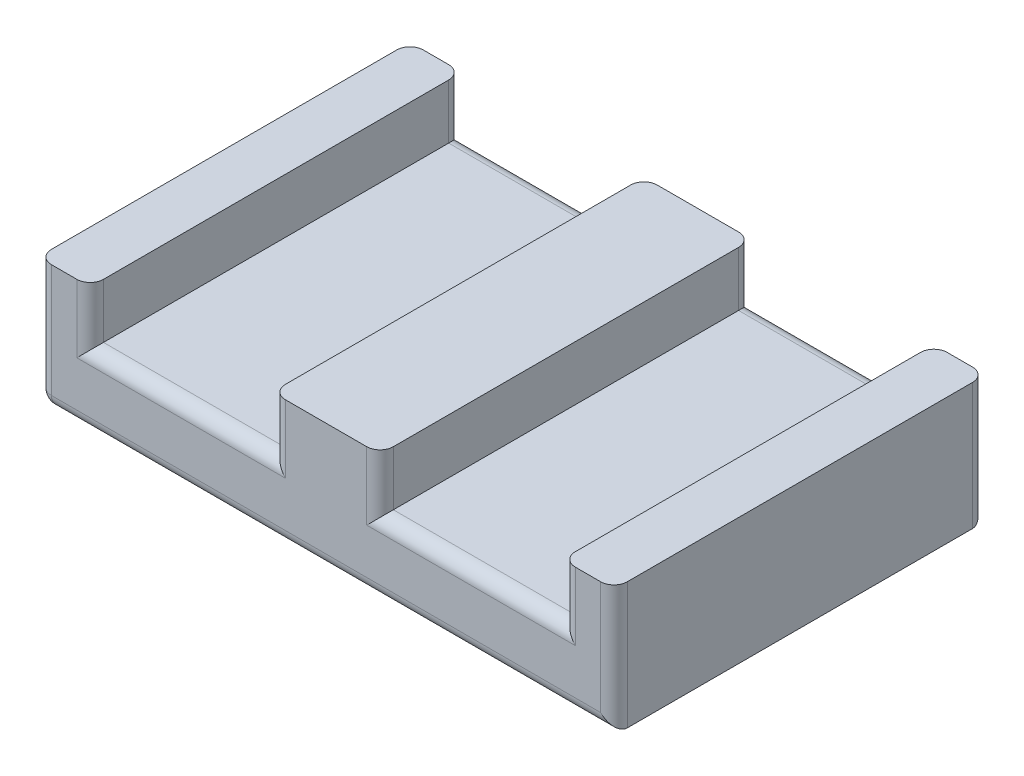
ISO-10303-21;
HEADER;
FILE_DESCRIPTION(('STEP AP214'),'2;1');
FILE_NAME('part.step','',(''),(''),'','','');
FILE_SCHEMA(('AUTOMOTIVE_DESIGN { 1 0 10303 214 1 1 1 1 }'));
ENDSEC;
DATA;
#1=APPLICATION_CONTEXT('core data for automotive mechanical design processes');
#2=APPLICATION_PROTOCOL_DEFINITION('international standard','automotive_design',2000,#1);
#3=PRODUCT_CONTEXT('',#1,'mechanical');
#4=PRODUCT('Part','Part','',(#3));
#5=PRODUCT_RELATED_PRODUCT_CATEGORY('part','',(#4));
#6=PRODUCT_DEFINITION_FORMATION('','',#4);
#7=PRODUCT_DEFINITION_CONTEXT('part definition',#1,'design');
#8=PRODUCT_DEFINITION('design','',#6,#7);
#9=PRODUCT_DEFINITION_SHAPE('','',#8);
#10=(LENGTH_UNIT() NAMED_UNIT(*) SI_UNIT(.MILLI.,.METRE.));
#11=(NAMED_UNIT(*) PLANE_ANGLE_UNIT() SI_UNIT($,.RADIAN.));
#12=(NAMED_UNIT(*) SI_UNIT($,.STERADIAN.) SOLID_ANGLE_UNIT());
#13=UNCERTAINTY_MEASURE_WITH_UNIT(LENGTH_MEASURE(1.E-05),#10,'distance_accuracy_value','');
#14=(GEOMETRIC_REPRESENTATION_CONTEXT(3) GLOBAL_UNCERTAINTY_ASSIGNED_CONTEXT((#13)) GLOBAL_UNIT_ASSIGNED_CONTEXT((#10,
#11,#12)) REPRESENTATION_CONTEXT('',''));
#15=CARTESIAN_POINT('',(0.,0.,0.));
#16=DIRECTION('',(0.,0.,1.));
#17=DIRECTION('',(1.,0.,0.));
#18=AXIS2_PLACEMENT_3D('',#15,#16,#17);
#19=CARTESIAN_POINT('',(0.,5.4,0.));
#20=DIRECTION('',(0.,-1.,0.));
#21=DIRECTION('',(0.,0.,-1.));
#22=AXIS2_PLACEMENT_3D('',#19,#20,#21);
#23=PLANE('',#22);
#24=DIRECTION('',(0.,0.,1.));
#25=VECTOR('',#24,1.);
#26=CARTESIAN_POINT('',(17.7,5.4,13.95));
#27=LINE('',#26,#25);
#28=CARTESIAN_POINT('',(17.7,5.4,-12.95));
#29=VERTEX_POINT('',#28);
#30=CARTESIAN_POINT('',(17.7,5.4,12.95));
#31=VERTEX_POINT('',#30);
#32=EDGE_CURVE('E343',#29,#31,#27,.T.);
#33=ORIENTED_EDGE('',*,*,#32,.F.);
#34=DIRECTION('',(-1.,0.,0.));
#35=VECTOR('',#34,1.);
#36=CARTESIAN_POINT('',(0.,5.4,-12.95));
#37=LINE('',#36,#35);
#38=CARTESIAN_POINT('',(4.05,5.4,-12.95));
#39=VERTEX_POINT('',#38);
#40=EDGE_CURVE('E292',#29,#39,#37,.T.);
#41=ORIENTED_EDGE('',*,*,#40,.T.);
#42=DIRECTION('',(0.,0.,-1.));
#43=VECTOR('',#42,1.);
#44=CARTESIAN_POINT('',(4.05,5.4,-13.95));
#45=LINE('',#44,#43);
#46=CARTESIAN_POINT('',(4.05,5.4,12.95));
#47=VERTEX_POINT('',#46);
#48=EDGE_CURVE('E399',#47,#39,#45,.T.);
#49=ORIENTED_EDGE('',*,*,#48,.F.);
#50=DIRECTION('',(1.,0.,0.));
#51=VECTOR('',#50,1.);
#52=CARTESIAN_POINT('',(0.,5.4,12.95));
#53=LINE('',#52,#51);
#54=EDGE_CURVE('E290',#47,#31,#53,.T.);
#55=ORIENTED_EDGE('',*,*,#54,.T.);
#56=EDGE_LOOP('',(#33,#41,#49,#55));
#57=FACE_BOUND('',#56,.T.);
#58=ADVANCED_FACE('F35',(#57),#23,.F.);
#59=DIRECTION('',(0.,0.,1.));
#60=VECTOR('',#59,1.);
#61=CARTESIAN_POINT('',(-4.05,5.4,-13.95));
#62=LINE('',#61,#60);
#63=CARTESIAN_POINT('',(-4.05,5.4,-12.95));
#64=VERTEX_POINT('',#63);
#65=CARTESIAN_POINT('',(-4.05,5.4,12.95));
#66=VERTEX_POINT('',#65);
#67=EDGE_CURVE('E405',#64,#66,#62,.T.);
#68=ORIENTED_EDGE('',*,*,#67,.F.);
#69=DIRECTION('',(-1.,0.,0.));
#70=VECTOR('',#69,1.);
#71=CARTESIAN_POINT('',(0.,5.4,-12.95));
#72=LINE('',#71,#70);
#73=CARTESIAN_POINT('',(-17.7,5.4,-12.95));
#74=VERTEX_POINT('',#73);
#75=EDGE_CURVE('E297',#64,#74,#72,.T.);
#76=ORIENTED_EDGE('',*,*,#75,.T.);
#77=DIRECTION('',(0.,0.,-1.));
#78=VECTOR('',#77,1.);
#79=CARTESIAN_POINT('',(-17.7,5.4,13.95));
#80=LINE('',#79,#78);
#81=CARTESIAN_POINT('',(-17.7,5.4,12.95));
#82=VERTEX_POINT('',#81);
#83=EDGE_CURVE('E227',#82,#74,#80,.T.);
#84=ORIENTED_EDGE('',*,*,#83,.F.);
#85=DIRECTION('',(1.,0.,0.));
#86=VECTOR('',#85,1.);
#87=CARTESIAN_POINT('',(0.,5.4,12.95));
#88=LINE('',#87,#86);
#89=EDGE_CURVE('E295',#82,#66,#88,.T.);
#90=ORIENTED_EDGE('',*,*,#89,.T.);
#91=EDGE_LOOP('',(#68,#76,#84,#90));
#92=FACE_BOUND('',#91,.T.);
#93=ADVANCED_FACE('F467',(#92),#23,.F.);
#94=CARTESIAN_POINT('',(21.6,5.4,13.95));
#95=DIRECTION('',(-1.,0.,0.));
#96=DIRECTION('',(0.,0.,1.));
#97=AXIS2_PLACEMENT_3D('',#94,#95,#96);
#98=PLANE('',#97);
#99=DIRECTION('',(0.,0.,-1.));
#100=VECTOR('',#99,1.);
#101=CARTESIAN_POINT('',(21.6,9.5,13.95));
#102=LINE('',#101,#100);
#103=CARTESIAN_POINT('',(21.6,9.5,12.95));
#104=VERTEX_POINT('',#103);
#105=CARTESIAN_POINT('',(21.6,9.5,-12.95));
#106=VERTEX_POINT('',#105);
#107=EDGE_CURVE('E426',#104,#106,#102,.T.);
#108=ORIENTED_EDGE('',*,*,#107,.F.);
#109=DIRECTION('',(0.,-1.,0.));
#110=VECTOR('',#109,1.);
#111=CARTESIAN_POINT('',(21.6,5.4,12.95));
#112=LINE('',#111,#110);
#113=CARTESIAN_POINT('',(21.6,0.,12.95));
#114=VERTEX_POINT('',#113);
#115=EDGE_CURVE('E217',#104,#114,#112,.T.);
#116=ORIENTED_EDGE('',*,*,#115,.T.);
#117=DIRECTION('',(0.,0.,-1.));
#118=VECTOR('',#117,1.);
#119=CARTESIAN_POINT('',(21.6,0.,13.95));
#120=LINE('',#119,#118);
#121=CARTESIAN_POINT('',(21.6,0.,-12.95));
#122=VERTEX_POINT('',#121);
#123=EDGE_CURVE('E375',#114,#122,#120,.T.);
#124=ORIENTED_EDGE('',*,*,#123,.T.);
#125=DIRECTION('',(0.,-1.,0.));
#126=VECTOR('',#125,1.);
#127=CARTESIAN_POINT('',(21.6,5.4,-12.95));
#128=LINE('',#127,#126);
#129=EDGE_CURVE('E282',#122,#106,#128,.F.);
#130=ORIENTED_EDGE('',*,*,#129,.T.);
#131=EDGE_LOOP('',(#108,#116,#124,#130));
#132=FACE_BOUND('',#131,.T.);
#133=ADVANCED_FACE('F472',(#132),#98,.F.);
#134=CARTESIAN_POINT('',(-21.6,5.4,-13.95));
#135=DIRECTION('',(0.,0.,1.));
#136=DIRECTION('',(1.,0.,0.));
#137=AXIS2_PLACEMENT_3D('',#134,#135,#136);
#138=PLANE('',#137);
#139=DIRECTION('',(-1.,0.,0.));
#140=VECTOR('',#139,1.);
#141=CARTESIAN_POINT('',(-21.6,1.,-13.95));
#142=LINE('',#141,#140);
#143=CARTESIAN_POINT('',(20.6,1.,-13.95));
#144=VERTEX_POINT('',#143);
#145=CARTESIAN_POINT('',(-20.6,1.,-13.95));
#146=VERTEX_POINT('',#145);
#147=EDGE_CURVE('E278',#144,#146,#142,.T.);
#148=ORIENTED_EDGE('',*,*,#147,.T.);
#149=DIRECTION('',(0.,-1.,0.));
#150=VECTOR('',#149,1.);
#151=CARTESIAN_POINT('',(-20.6,5.4,-13.95));
#152=LINE('',#151,#150);
#153=CARTESIAN_POINT('',(-20.6,9.5,-13.95));
#154=VERTEX_POINT('',#153);
#155=EDGE_CURVE('E280',#146,#154,#152,.F.);
#156=ORIENTED_EDGE('',*,*,#155,.T.);
#157=DIRECTION('',(-1.,0.,0.));
#158=VECTOR('',#157,1.);
#159=CARTESIAN_POINT('',(-21.6,9.5,-13.95));
#160=LINE('',#159,#158);
#161=CARTESIAN_POINT('',(-18.7,9.5,-13.95));
#162=VERTEX_POINT('',#161);
#163=EDGE_CURVE('E406',#162,#154,#160,.T.);
#164=ORIENTED_EDGE('',*,*,#163,.F.);
#165=DIRECTION('',(0.,-1.,0.));
#166=VECTOR('',#165,1.);
#167=CARTESIAN_POINT('',(-18.7,5.4,-13.95));
#168=LINE('',#167,#166);
#169=CARTESIAN_POINT('',(-18.7,4.4,-13.95));
#170=VERTEX_POINT('',#169);
#171=EDGE_CURVE('E274',#162,#170,#168,.T.);
#172=ORIENTED_EDGE('',*,*,#171,.T.);
#173=DIRECTION('',(-1.,0.,0.));
#174=VECTOR('',#173,1.);
#175=CARTESIAN_POINT('',(-21.6,4.4,-13.95));
#176=LINE('',#175,#174);
#177=CARTESIAN_POINT('',(-3.05,4.4,-13.95));
#178=VERTEX_POINT('',#177);
#179=EDGE_CURVE('E272',#170,#178,#176,.F.);
#180=ORIENTED_EDGE('',*,*,#179,.T.);
#181=DIRECTION('',(0.,-1.,0.));
#182=VECTOR('',#181,1.);
#183=CARTESIAN_POINT('',(-3.05,5.4,-13.95));
#184=LINE('',#183,#182);
#185=CARTESIAN_POINT('',(-3.05,9.5,-13.95));
#186=VERTEX_POINT('',#185);
#187=EDGE_CURVE('E270',#178,#186,#184,.F.);
#188=ORIENTED_EDGE('',*,*,#187,.T.);
#189=DIRECTION('',(-1.,0.,0.));
#190=VECTOR('',#189,1.);
#191=CARTESIAN_POINT('',(-4.05,9.5,-13.95));
#192=LINE('',#191,#190);
#193=CARTESIAN_POINT('',(3.05,9.5,-13.95));
#194=VERTEX_POINT('',#193);
#195=EDGE_CURVE('E414',#194,#186,#192,.T.);
#196=ORIENTED_EDGE('',*,*,#195,.F.);
#197=DIRECTION('',(0.,-1.,0.));
#198=VECTOR('',#197,1.);
#199=CARTESIAN_POINT('',(3.05,5.4,-13.95));
#200=LINE('',#199,#198);
#201=CARTESIAN_POINT('',(3.05,4.4,-13.95));
#202=VERTEX_POINT('',#201);
#203=EDGE_CURVE('E268',#194,#202,#200,.T.);
#204=ORIENTED_EDGE('',*,*,#203,.T.);
#205=DIRECTION('',(-1.,0.,0.));
#206=VECTOR('',#205,1.);
#207=CARTESIAN_POINT('',(-21.6,4.4,-13.95));
#208=LINE('',#207,#206);
#209=CARTESIAN_POINT('',(18.7,4.4,-13.95));
#210=VERTEX_POINT('',#209);
#211=EDGE_CURVE('E266',#202,#210,#208,.F.);
#212=ORIENTED_EDGE('',*,*,#211,.T.);
#213=DIRECTION('',(0.,-1.,0.));
#214=VECTOR('',#213,1.);
#215=CARTESIAN_POINT('',(18.7,5.4,-13.95));
#216=LINE('',#215,#214);
#217=CARTESIAN_POINT('',(18.7,9.5,-13.95));
#218=VERTEX_POINT('',#217);
#219=EDGE_CURVE('E264',#210,#218,#216,.F.);
#220=ORIENTED_EDGE('',*,*,#219,.T.);
#221=DIRECTION('',(-1.,0.,0.));
#222=VECTOR('',#221,1.);
#223=CARTESIAN_POINT('',(21.6,9.5,-13.95));
#224=LINE('',#223,#222);
#225=CARTESIAN_POINT('',(20.6,9.5,-13.95));
#226=VERTEX_POINT('',#225);
#227=EDGE_CURVE('E429',#226,#218,#224,.T.);
#228=ORIENTED_EDGE('',*,*,#227,.F.);
#229=DIRECTION('',(0.,-1.,0.));
#230=VECTOR('',#229,1.);
#231=CARTESIAN_POINT('',(20.6,5.4,-13.95));
#232=LINE('',#231,#230);
#233=EDGE_CURVE('E276',#226,#144,#232,.T.);
#234=ORIENTED_EDGE('',*,*,#233,.T.);
#235=EDGE_LOOP('',(#148,#156,#164,#172,#180,#188,#196,#204,#212,#220,#228,#234));
#236=FACE_BOUND('',#235,.T.);
#237=ADVANCED_FACE('F445',(#236),#138,.F.);
#238=CARTESIAN_POINT('',(-21.6,5.4,13.95));
#239=DIRECTION('',(1.,0.,0.));
#240=DIRECTION('',(0.,0.,-1.));
#241=AXIS2_PLACEMENT_3D('',#238,#239,#240);
#242=PLANE('',#241);
#243=DIRECTION('',(0.,0.,1.));
#244=VECTOR('',#243,1.);
#245=CARTESIAN_POINT('',(-21.6,1.,13.95));
#246=LINE('',#245,#244);
#247=CARTESIAN_POINT('',(-21.6,1.,-12.95));
#248=VERTEX_POINT('',#247);
#249=CARTESIAN_POINT('',(-21.6,1.,12.95));
#250=VERTEX_POINT('',#249);
#251=EDGE_CURVE('E252',#248,#250,#246,.T.);
#252=ORIENTED_EDGE('',*,*,#251,.T.);
#253=DIRECTION('',(0.,-1.,0.));
#254=VECTOR('',#253,1.);
#255=CARTESIAN_POINT('',(-21.6,5.4,12.95));
#256=LINE('',#255,#254);
#257=CARTESIAN_POINT('',(-21.6,9.5,12.95));
#258=VERTEX_POINT('',#257);
#259=EDGE_CURVE('E254',#250,#258,#256,.F.);
#260=ORIENTED_EDGE('',*,*,#259,.T.);
#261=DIRECTION('',(0.,0.,1.));
#262=VECTOR('',#261,1.);
#263=CARTESIAN_POINT('',(-21.6,9.5,13.95));
#264=LINE('',#263,#262);
#265=CARTESIAN_POINT('',(-21.6,9.5,-12.95));
#266=VERTEX_POINT('',#265);
#267=EDGE_CURVE('E418',#266,#258,#264,.T.);
#268=ORIENTED_EDGE('',*,*,#267,.F.);
#269=DIRECTION('',(0.,-1.,0.));
#270=VECTOR('',#269,1.);
#271=CARTESIAN_POINT('',(-21.6,5.4,-12.95));
#272=LINE('',#271,#270);
#273=EDGE_CURVE('E250',#266,#248,#272,.T.);
#274=ORIENTED_EDGE('',*,*,#273,.T.);
#275=EDGE_LOOP('',(#252,#260,#268,#274));
#276=FACE_BOUND('',#275,.T.);
#277=ADVANCED_FACE('F483',(#276),#242,.F.);
#278=CARTESIAN_POINT('',(-21.6,5.4,13.95));
#279=DIRECTION('',(0.,0.,-1.));
#280=DIRECTION('',(-1.,0.,0.));
#281=AXIS2_PLACEMENT_3D('',#278,#279,#280);
#282=PLANE('',#281);
#283=DIRECTION('',(1.,0.,0.));
#284=VECTOR('',#283,1.);
#285=CARTESIAN_POINT('',(-21.6,9.5,13.95));
#286=LINE('',#285,#284);
#287=CARTESIAN_POINT('',(-20.6,9.5,13.95));
#288=VERTEX_POINT('',#287);
#289=CARTESIAN_POINT('',(-18.7,9.5,13.95));
#290=VERTEX_POINT('',#289);
#291=EDGE_CURVE('E422',#288,#290,#286,.T.);
#292=ORIENTED_EDGE('',*,*,#291,.F.);
#293=DIRECTION('',(0.,-1.,0.));
#294=VECTOR('',#293,1.);
#295=CARTESIAN_POINT('',(-20.6,5.4,13.95));
#296=LINE('',#295,#294);
#297=CARTESIAN_POINT('',(-20.6,1.,13.95));
#298=VERTEX_POINT('',#297);
#299=EDGE_CURVE('E242',#288,#298,#296,.T.);
#300=ORIENTED_EDGE('',*,*,#299,.T.);
#301=DIRECTION('',(1.,0.,0.));
#302=VECTOR('',#301,1.);
#303=CARTESIAN_POINT('',(21.6,1.,13.95));
#304=LINE('',#303,#302);
#305=CARTESIAN_POINT('',(20.6,1.,13.95));
#306=VERTEX_POINT('',#305);
#307=EDGE_CURVE('E235',#298,#306,#304,.T.);
#308=ORIENTED_EDGE('',*,*,#307,.T.);
#309=DIRECTION('',(0.,-1.,0.));
#310=VECTOR('',#309,1.);
#311=CARTESIAN_POINT('',(20.6,5.4,13.95));
#312=LINE('',#311,#310);
#313=CARTESIAN_POINT('',(20.6,9.5,13.95));
#314=VERTEX_POINT('',#313);
#315=EDGE_CURVE('E226',#306,#314,#312,.F.);
#316=ORIENTED_EDGE('',*,*,#315,.T.);
#317=DIRECTION('',(1.,0.,0.));
#318=VECTOR('',#317,1.);
#319=CARTESIAN_POINT('',(21.6,9.5,13.95));
#320=LINE('',#319,#318);
#321=CARTESIAN_POINT('',(18.7,9.5,13.95));
#322=VERTEX_POINT('',#321);
#323=EDGE_CURVE('E209',#322,#314,#320,.T.);
#324=ORIENTED_EDGE('',*,*,#323,.F.);
#325=DIRECTION('',(0.,-1.,0.));
#326=VECTOR('',#325,1.);
#327=CARTESIAN_POINT('',(18.7,5.4,13.95));
#328=LINE('',#327,#326);
#329=CARTESIAN_POINT('',(18.7,4.4,13.95));
#330=VERTEX_POINT('',#329);
#331=EDGE_CURVE('E223',#322,#330,#328,.T.);
#332=ORIENTED_EDGE('',*,*,#331,.T.);
#333=DIRECTION('',(1.,0.,0.));
#334=VECTOR('',#333,1.);
#335=CARTESIAN_POINT('',(-21.6,4.4,13.95));
#336=LINE('',#335,#334);
#337=CARTESIAN_POINT('',(3.05,4.4,13.95));
#338=VERTEX_POINT('',#337);
#339=EDGE_CURVE('E233',#330,#338,#336,.F.);
#340=ORIENTED_EDGE('',*,*,#339,.T.);
#341=DIRECTION('',(0.,-1.,0.));
#342=VECTOR('',#341,1.);
#343=CARTESIAN_POINT('',(3.05,5.4,13.95));
#344=LINE('',#343,#342);
#345=CARTESIAN_POINT('',(3.05,9.5,13.95));
#346=VERTEX_POINT('',#345);
#347=EDGE_CURVE('E237',#338,#346,#344,.F.);
#348=ORIENTED_EDGE('',*,*,#347,.T.);
#349=DIRECTION('',(1.,0.,0.));
#350=VECTOR('',#349,1.);
#351=CARTESIAN_POINT('',(-4.05,9.5,13.95));
#352=LINE('',#351,#350);
#353=CARTESIAN_POINT('',(-3.05,9.5,13.95));
#354=VERTEX_POINT('',#353);
#355=EDGE_CURVE('E380',#354,#346,#352,.T.);
#356=ORIENTED_EDGE('',*,*,#355,.F.);
#357=DIRECTION('',(0.,-1.,0.));
#358=VECTOR('',#357,1.);
#359=CARTESIAN_POINT('',(-3.05,5.4,13.95));
#360=LINE('',#359,#358);
#361=CARTESIAN_POINT('',(-3.05,4.4,13.95));
#362=VERTEX_POINT('',#361);
#363=EDGE_CURVE('E377',#354,#362,#360,.T.);
#364=ORIENTED_EDGE('',*,*,#363,.T.);
#365=DIRECTION('',(1.,0.,0.));
#366=VECTOR('',#365,1.);
#367=CARTESIAN_POINT('',(-21.6,4.4,13.95));
#368=LINE('',#367,#366);
#369=CARTESIAN_POINT('',(-18.7,4.4,13.95));
#370=VERTEX_POINT('',#369);
#371=EDGE_CURVE('E367',#362,#370,#368,.F.);
#372=ORIENTED_EDGE('',*,*,#371,.T.);
#373=DIRECTION('',(0.,-1.,0.));
#374=VECTOR('',#373,1.);
#375=CARTESIAN_POINT('',(-18.7,5.4,13.95));
#376=LINE('',#375,#374);
#377=EDGE_CURVE('E373',#370,#290,#376,.F.);
#378=ORIENTED_EDGE('',*,*,#377,.T.);
#379=EDGE_LOOP('',(#292,#300,#308,#316,#324,#332,#340,#348,#356,#364,#372,#378));
#380=FACE_BOUND('',#379,.T.);
#381=ADVANCED_FACE('F222',(#380),#282,.F.);
#382=CARTESIAN_POINT('',(0.,0.,0.));
#383=DIRECTION('',(0.,-1.,0.));
#384=DIRECTION('',(0.,0.,-1.));
#385=AXIS2_PLACEMENT_3D('',#382,#383,#384);
#386=PLANE('',#385);
#387=ORIENTED_EDGE('',*,*,#123,.F.);
#388=DIRECTION('',(1.,0.,0.));
#389=VECTOR('',#388,1.);
#390=CARTESIAN_POINT('',(-21.6,0.,12.95));
#391=LINE('',#390,#389);
#392=CARTESIAN_POINT('',(-20.6,0.,12.95));
#393=VERTEX_POINT('',#392);
#394=EDGE_CURVE('E248',#114,#393,#391,.F.);
#395=ORIENTED_EDGE('',*,*,#394,.T.);
#396=DIRECTION('',(0.,0.,1.));
#397=VECTOR('',#396,1.);
#398=CARTESIAN_POINT('',(-20.6,0.,-13.95));
#399=LINE('',#398,#397);
#400=CARTESIAN_POINT('',(-20.6,0.,-12.95));
#401=VERTEX_POINT('',#400);
#402=EDGE_CURVE('E246',#393,#401,#399,.F.);
#403=ORIENTED_EDGE('',*,*,#402,.T.);
#404=DIRECTION('',(-1.,0.,0.));
#405=VECTOR('',#404,1.);
#406=CARTESIAN_POINT('',(21.6,0.,-12.95));
#407=LINE('',#406,#405);
#408=EDGE_CURVE('E244',#401,#122,#407,.F.);
#409=ORIENTED_EDGE('',*,*,#408,.T.);
#410=EDGE_LOOP('',(#387,#395,#403,#409));
#411=FACE_BOUND('',#410,.T.);
#412=ADVANCED_FACE('F477',(#411),#386,.T.);
#413=CARTESIAN_POINT('',(4.05,9.5,-13.95));
#414=DIRECTION('',(-1.,0.,0.));
#415=DIRECTION('',(0.,0.,1.));
#416=AXIS2_PLACEMENT_3D('',#413,#414,#415);
#417=PLANE('',#416);
#418=ORIENTED_EDGE('',*,*,#48,.T.);
#419=DIRECTION('',(0.,-1.,0.));
#420=VECTOR('',#419,1.);
#421=CARTESIAN_POINT('',(4.05,9.5,-12.95));
#422=LINE('',#421,#420);
#423=CARTESIAN_POINT('',(4.05,9.5,-12.95));
#424=VERTEX_POINT('',#423);
#425=EDGE_CURVE('E52',#39,#424,#422,.F.);
#426=ORIENTED_EDGE('',*,*,#425,.T.);
#427=DIRECTION('',(0.,0.,-1.));
#428=VECTOR('',#427,1.);
#429=CARTESIAN_POINT('',(4.05,9.5,-13.95));
#430=LINE('',#429,#428);
#431=CARTESIAN_POINT('',(4.05,9.5,12.95));
#432=VERTEX_POINT('',#431);
#433=EDGE_CURVE('E400',#432,#424,#430,.T.);
#434=ORIENTED_EDGE('',*,*,#433,.F.);
#435=DIRECTION('',(0.,-1.,0.));
#436=VECTOR('',#435,1.);
#437=CARTESIAN_POINT('',(4.05,9.5,12.95));
#438=LINE('',#437,#436);
#439=EDGE_CURVE('E315',#432,#47,#438,.T.);
#440=ORIENTED_EDGE('',*,*,#439,.T.);
#441=EDGE_LOOP('',(#418,#426,#434,#440));
#442=FACE_BOUND('',#441,.T.);
#443=ADVANCED_FACE('F398',(#442),#417,.F.);
#444=CARTESIAN_POINT('',(-4.05,9.5,-13.95));
#445=DIRECTION('',(1.,0.,0.));
#446=DIRECTION('',(0.,0.,-1.));
#447=AXIS2_PLACEMENT_3D('',#444,#445,#446);
#448=PLANE('',#447);
#449=DIRECTION('',(0.,0.,1.));
#450=VECTOR('',#449,1.);
#451=CARTESIAN_POINT('',(-4.05,9.5,-13.95));
#452=LINE('',#451,#450);
#453=CARTESIAN_POINT('',(-4.05,9.5,-12.95));
#454=VERTEX_POINT('',#453);
#455=CARTESIAN_POINT('',(-4.05,9.5,12.95));
#456=VERTEX_POINT('',#455);
#457=EDGE_CURVE('E392',#454,#456,#452,.T.);
#458=ORIENTED_EDGE('',*,*,#457,.F.);
#459=DIRECTION('',(0.,-1.,0.));
#460=VECTOR('',#459,1.);
#461=CARTESIAN_POINT('',(-4.05,9.5,-12.95));
#462=LINE('',#461,#460);
#463=EDGE_CURVE('E306',#454,#64,#462,.T.);
#464=ORIENTED_EDGE('',*,*,#463,.T.);
#465=ORIENTED_EDGE('',*,*,#67,.T.);
#466=DIRECTION('',(0.,-1.,0.));
#467=VECTOR('',#466,1.);
#468=CARTESIAN_POINT('',(-4.05,9.5,12.95));
#469=LINE('',#468,#467);
#470=EDGE_CURVE('E304',#66,#456,#469,.F.);
#471=ORIENTED_EDGE('',*,*,#470,.T.);
#472=EDGE_LOOP('',(#458,#464,#465,#471));
#473=FACE_BOUND('',#472,.T.);
#474=ADVANCED_FACE('F554',(#473),#448,.F.);
#475=CARTESIAN_POINT('',(0.,9.5,0.));
#476=DIRECTION('',(0.,1.,0.));
#477=DIRECTION('',(0.,0.,1.));
#478=AXIS2_PLACEMENT_3D('',#475,#476,#477);
#479=PLANE('',#478);
#480=ORIENTED_EDGE('',*,*,#195,.T.);
#481=CARTESIAN_POINT('',(-3.05,9.5,-12.95));
#482=DIRECTION('',(0.,1.,0.));
#483=DIRECTION('',(0.,0.,1.));
#484=AXIS2_PLACEMENT_3D('',#481,#482,#483);
#485=CIRCLE('',#484,1.);
#486=EDGE_CURVE('E313',#186,#454,#485,.T.);
#487=ORIENTED_EDGE('',*,*,#486,.T.);
#488=ORIENTED_EDGE('',*,*,#457,.T.);
#489=CARTESIAN_POINT('',(-3.05,9.5,12.95));
#490=DIRECTION('',(0.,1.,0.));
#491=DIRECTION('',(0.,0.,1.));
#492=AXIS2_PLACEMENT_3D('',#489,#490,#491);
#493=CIRCLE('',#492,1.);
#494=EDGE_CURVE('E308',#456,#354,#493,.T.);
#495=ORIENTED_EDGE('',*,*,#494,.T.);
#496=ORIENTED_EDGE('',*,*,#355,.T.);
#497=CARTESIAN_POINT('',(3.05,9.5,12.95));
#498=DIRECTION('',(0.,1.,0.));
#499=DIRECTION('',(0.,0.,1.));
#500=AXIS2_PLACEMENT_3D('',#497,#498,#499);
#501=CIRCLE('',#500,1.);
#502=EDGE_CURVE('E59',#346,#432,#501,.T.);
#503=ORIENTED_EDGE('',*,*,#502,.T.);
#504=ORIENTED_EDGE('',*,*,#433,.T.);
#505=CARTESIAN_POINT('',(3.05,9.5,-12.95));
#506=DIRECTION('',(0.,1.,0.));
#507=DIRECTION('',(0.,0.,1.));
#508=AXIS2_PLACEMENT_3D('',#505,#506,#507);
#509=CIRCLE('',#508,1.);
#510=EDGE_CURVE('E311',#424,#194,#509,.T.);
#511=ORIENTED_EDGE('',*,*,#510,.T.);
#512=EDGE_LOOP('',(#480,#487,#488,#495,#496,#503,#504,#511));
#513=FACE_BOUND('',#512,.T.);
#514=ADVANCED_FACE('F389',(#513),#479,.T.);
#515=CARTESIAN_POINT('',(-17.7,9.5,13.95));
#516=DIRECTION('',(-1.,0.,0.));
#517=DIRECTION('',(0.,0.,1.));
#518=AXIS2_PLACEMENT_3D('',#515,#516,#517);
#519=PLANE('',#518);
#520=ORIENTED_EDGE('',*,*,#83,.T.);
#521=DIRECTION('',(0.,-1.,0.));
#522=VECTOR('',#521,1.);
#523=CARTESIAN_POINT('',(-17.7,9.5,-12.95));
#524=LINE('',#523,#522);
#525=CARTESIAN_POINT('',(-17.7,9.5,-12.95));
#526=VERTEX_POINT('',#525);
#527=EDGE_CURVE('E302',#74,#526,#524,.F.);
#528=ORIENTED_EDGE('',*,*,#527,.T.);
#529=DIRECTION('',(0.,0.,-1.));
#530=VECTOR('',#529,1.);
#531=CARTESIAN_POINT('',(-17.7,9.5,13.95));
#532=LINE('',#531,#530);
#533=CARTESIAN_POINT('',(-17.7,9.5,12.95));
#534=VERTEX_POINT('',#533);
#535=EDGE_CURVE('E410',#534,#526,#532,.T.);
#536=ORIENTED_EDGE('',*,*,#535,.F.);
#537=DIRECTION('',(0.,-1.,0.));
#538=VECTOR('',#537,1.);
#539=CARTESIAN_POINT('',(-17.7,9.5,12.95));
#540=LINE('',#539,#538);
#541=EDGE_CURVE('E300',#534,#82,#540,.T.);
#542=ORIENTED_EDGE('',*,*,#541,.T.);
#543=EDGE_LOOP('',(#520,#528,#536,#542));
#544=FACE_BOUND('',#543,.T.);
#545=ADVANCED_FACE('F695',(#544),#519,.F.);
#546=CARTESIAN_POINT('',(0.,9.5,0.));
#547=DIRECTION('',(0.,-1.,0.));
#548=DIRECTION('',(0.,0.,-1.));
#549=AXIS2_PLACEMENT_3D('',#546,#547,#548);
#550=PLANE('',#549);
#551=ORIENTED_EDGE('',*,*,#267,.T.);
#552=CARTESIAN_POINT('',(-20.6,9.5,12.95));
#553=DIRECTION('',(0.,-1.,0.));
#554=DIRECTION('',(0.,0.,-1.));
#555=AXIS2_PLACEMENT_3D('',#552,#553,#554);
#556=CIRCLE('',#555,1.);
#557=EDGE_CURVE('E262',#258,#288,#556,.F.);
#558=ORIENTED_EDGE('',*,*,#557,.T.);
#559=ORIENTED_EDGE('',*,*,#291,.T.);
#560=CARTESIAN_POINT('',(-18.7,9.5,12.95));
#561=DIRECTION('',(0.,-1.,0.));
#562=DIRECTION('',(0.,0.,-1.));
#563=AXIS2_PLACEMENT_3D('',#560,#561,#562);
#564=CIRCLE('',#563,1.);
#565=EDGE_CURVE('E256',#290,#534,#564,.F.);
#566=ORIENTED_EDGE('',*,*,#565,.T.);
#567=ORIENTED_EDGE('',*,*,#535,.T.);
#568=CARTESIAN_POINT('',(-18.7,9.5,-12.95));
#569=DIRECTION('',(0.,-1.,0.));
#570=DIRECTION('',(0.,0.,-1.));
#571=AXIS2_PLACEMENT_3D('',#568,#569,#570);
#572=CIRCLE('',#571,1.);
#573=EDGE_CURVE('E258',#526,#162,#572,.F.);
#574=ORIENTED_EDGE('',*,*,#573,.T.);
#575=ORIENTED_EDGE('',*,*,#163,.T.);
#576=CARTESIAN_POINT('',(-20.6,9.5,-12.95));
#577=DIRECTION('',(0.,-1.,0.));
#578=DIRECTION('',(0.,0.,-1.));
#579=AXIS2_PLACEMENT_3D('',#576,#577,#578);
#580=CIRCLE('',#579,1.);
#581=EDGE_CURVE('E260',#154,#266,#580,.F.);
#582=ORIENTED_EDGE('',*,*,#581,.T.);
#583=EDGE_LOOP('',(#551,#558,#559,#566,#567,#574,#575,#582));
#584=FACE_BOUND('',#583,.T.);
#585=ADVANCED_FACE('F686',(#584),#550,.F.);
#586=CARTESIAN_POINT('',(17.7,9.5,13.95));
#587=DIRECTION('',(1.,0.,0.));
#588=DIRECTION('',(0.,0.,-1.));
#589=AXIS2_PLACEMENT_3D('',#586,#587,#588);
#590=PLANE('',#589);
#591=DIRECTION('',(0.,0.,1.));
#592=VECTOR('',#591,1.);
#593=CARTESIAN_POINT('',(17.7,9.5,13.95));
#594=LINE('',#593,#592);
#595=CARTESIAN_POINT('',(17.7,9.5,-12.95));
#596=VERTEX_POINT('',#595);
#597=CARTESIAN_POINT('',(17.7,9.5,12.95));
#598=VERTEX_POINT('',#597);
#599=EDGE_CURVE('E212',#596,#598,#594,.T.);
#600=ORIENTED_EDGE('',*,*,#599,.F.);
#601=DIRECTION('',(0.,-1.,0.));
#602=VECTOR('',#601,1.);
#603=CARTESIAN_POINT('',(17.7,9.5,-12.95));
#604=LINE('',#603,#602);
#605=EDGE_CURVE('E11',#596,#29,#604,.T.);
#606=ORIENTED_EDGE('',*,*,#605,.T.);
#607=ORIENTED_EDGE('',*,*,#32,.T.);
#608=DIRECTION('',(0.,-1.,0.));
#609=VECTOR('',#608,1.);
#610=CARTESIAN_POINT('',(17.7,9.5,12.95));
#611=LINE('',#610,#609);
#612=EDGE_CURVE('E44',#31,#598,#611,.F.);
#613=ORIENTED_EDGE('',*,*,#612,.T.);
#614=EDGE_LOOP('',(#600,#606,#607,#613));
#615=FACE_BOUND('',#614,.T.);
#616=ADVANCED_FACE('F454',(#615),#590,.F.);
#617=CARTESIAN_POINT('',(0.,9.5,0.));
#618=DIRECTION('',(0.,1.,0.));
#619=DIRECTION('',(0.,0.,1.));
#620=AXIS2_PLACEMENT_3D('',#617,#618,#619);
#621=PLANE('',#620);
#622=ORIENTED_EDGE('',*,*,#323,.T.);
#623=CARTESIAN_POINT('',(20.6,9.5,12.95));
#624=DIRECTION('',(0.,1.,0.));
#625=DIRECTION('',(0.,0.,1.));
#626=AXIS2_PLACEMENT_3D('',#623,#624,#625);
#627=CIRCLE('',#626,1.);
#628=EDGE_CURVE('E288',#314,#104,#627,.T.);
#629=ORIENTED_EDGE('',*,*,#628,.T.);
#630=ORIENTED_EDGE('',*,*,#107,.T.);
#631=CARTESIAN_POINT('',(20.6,9.5,-12.95));
#632=DIRECTION('',(0.,1.,0.));
#633=DIRECTION('',(0.,0.,1.));
#634=AXIS2_PLACEMENT_3D('',#631,#632,#633);
#635=CIRCLE('',#634,1.);
#636=EDGE_CURVE('E286',#106,#226,#635,.T.);
#637=ORIENTED_EDGE('',*,*,#636,.T.);
#638=ORIENTED_EDGE('',*,*,#227,.T.);
#639=CARTESIAN_POINT('',(18.7,9.5,-12.95));
#640=DIRECTION('',(0.,1.,0.));
#641=DIRECTION('',(0.,0.,1.));
#642=AXIS2_PLACEMENT_3D('',#639,#640,#641);
#643=CIRCLE('',#642,1.);
#644=EDGE_CURVE('E216',#218,#596,#643,.T.);
#645=ORIENTED_EDGE('',*,*,#644,.T.);
#646=ORIENTED_EDGE('',*,*,#599,.T.);
#647=CARTESIAN_POINT('',(18.7,9.5,12.95));
#648=DIRECTION('',(0.,1.,0.));
#649=DIRECTION('',(0.,0.,1.));
#650=AXIS2_PLACEMENT_3D('',#647,#648,#649);
#651=CIRCLE('',#650,1.);
#652=EDGE_CURVE('E206',#598,#322,#651,.T.);
#653=ORIENTED_EDGE('',*,*,#652,.T.);
#654=EDGE_LOOP('',(#622,#629,#630,#637,#638,#645,#646,#653));
#655=FACE_BOUND('',#654,.T.);
#656=ADVANCED_FACE('F208',(#655),#621,.T.);
#657=CARTESIAN_POINT('',(20.6,5.4,-12.95));
#658=DIRECTION('',(0.,-1.,0.));
#659=DIRECTION('',(0.,0.,-1.));
#660=AXIS2_PLACEMENT_3D('',#657,#658,#659);
#661=CYLINDRICAL_SURFACE('',#660,1.);
#662=ORIENTED_EDGE('',*,*,#636,.F.);
#663=ORIENTED_EDGE('',*,*,#129,.F.);
#664=CARTESIAN_POINT('',(20.6,1.,-12.95));
#665=DIRECTION('',(-0.707106781186547,-0.707106781186547,0.));
#666=DIRECTION('',(0.707106781186547,-0.707106781186547,0.));
#667=AXIS2_PLACEMENT_3D('',#664,#665,#666);
#668=ELLIPSE('',#667,1.41421356237309,1.);
#669=EDGE_CURVE('E340',#144,#122,#668,.T.);
#670=ORIENTED_EDGE('',*,*,#669,.F.);
#671=ORIENTED_EDGE('',*,*,#233,.F.);
#672=EDGE_LOOP('',(#662,#663,#670,#671));
#673=FACE_BOUND('',#672,.T.);
#674=ADVANCED_FACE('F441',(#673),#661,.T.);
#675=CARTESIAN_POINT('',(-21.6,1.,-12.95));
#676=DIRECTION('',(1.,0.,0.));
#677=DIRECTION('',(0.,0.,-1.));
#678=AXIS2_PLACEMENT_3D('',#675,#676,#677);
#679=CYLINDRICAL_SURFACE('',#678,1.);
#680=ORIENTED_EDGE('',*,*,#669,.T.);
#681=ORIENTED_EDGE('',*,*,#408,.F.);
#682=CARTESIAN_POINT('',(-20.6,1.,-12.95));
#683=DIRECTION('',(-1.,0.,0.));
#684=DIRECTION('',(0.,0.,1.));
#685=AXIS2_PLACEMENT_3D('',#682,#683,#684);
#686=CIRCLE('',#685,1.);
#687=EDGE_CURVE('E337',#146,#401,#686,.T.);
#688=ORIENTED_EDGE('',*,*,#687,.F.);
#689=ORIENTED_EDGE('',*,*,#147,.F.);
#690=EDGE_LOOP('',(#680,#681,#688,#689));
#691=FACE_BOUND('',#690,.T.);
#692=ADVANCED_FACE('F518',(#691),#679,.T.);
#693=CARTESIAN_POINT('',(-20.6,5.4,-12.95));
#694=DIRECTION('',(0.,-1.,0.));
#695=DIRECTION('',(0.,0.,-1.));
#696=AXIS2_PLACEMENT_3D('',#693,#694,#695);
#697=CYLINDRICAL_SURFACE('',#696,1.);
#698=ORIENTED_EDGE('',*,*,#581,.F.);
#699=ORIENTED_EDGE('',*,*,#155,.F.);
#700=CARTESIAN_POINT('',(-20.6,1.,-12.95));
#701=DIRECTION('',(0.,-1.,0.));
#702=DIRECTION('',(0.,0.,-1.));
#703=AXIS2_PLACEMENT_3D('',#700,#701,#702);
#704=CIRCLE('',#703,1.);
#705=EDGE_CURVE('E334',#248,#146,#704,.T.);
#706=ORIENTED_EDGE('',*,*,#705,.F.);
#707=ORIENTED_EDGE('',*,*,#273,.F.);
#708=EDGE_LOOP('',(#698,#699,#706,#707));
#709=FACE_BOUND('',#708,.T.);
#710=ADVANCED_FACE('F514',(#709),#697,.T.);
#711=CARTESIAN_POINT('',(-20.6,1.,-12.95));
#712=DIRECTION('',(0.,0.,1.));
#713=DIRECTION('',(1.,0.,0.));
#714=AXIS2_PLACEMENT_3D('',#711,#712,#713);
#715=SPHERICAL_SURFACE('',#714,1.);
#716=ORIENTED_EDGE('',*,*,#705,.T.);
#717=ORIENTED_EDGE('',*,*,#687,.T.);
#718=CARTESIAN_POINT('',(-20.6,1.,-12.95));
#719=DIRECTION('',(0.,0.,-1.));
#720=DIRECTION('',(-1.,0.,0.));
#721=AXIS2_PLACEMENT_3D('',#718,#719,#720);
#722=CIRCLE('',#721,1.);
#723=EDGE_CURVE('E331',#248,#401,#722,.F.);
#724=ORIENTED_EDGE('',*,*,#723,.F.);
#725=EDGE_LOOP('',(#716,#717,#724));
#726=FACE_BOUND('',#725,.T.);
#727=ADVANCED_FACE('F510',(#726),#715,.T.);
#728=CARTESIAN_POINT('',(-20.6,1.,13.95));
#729=DIRECTION('',(0.,0.,-1.));
#730=DIRECTION('',(-1.,0.,0.));
#731=AXIS2_PLACEMENT_3D('',#728,#729,#730);
#732=CYLINDRICAL_SURFACE('',#731,1.);
#733=ORIENTED_EDGE('',*,*,#723,.T.);
#734=ORIENTED_EDGE('',*,*,#402,.F.);
#735=CARTESIAN_POINT('',(-20.6,1.,12.95));
#736=DIRECTION('',(0.,0.,1.));
#737=DIRECTION('',(1.,0.,0.));
#738=AXIS2_PLACEMENT_3D('',#735,#736,#737);
#739=CIRCLE('',#738,1.);
#740=EDGE_CURVE('E328',#250,#393,#739,.T.);
#741=ORIENTED_EDGE('',*,*,#740,.F.);
#742=ORIENTED_EDGE('',*,*,#251,.F.);
#743=EDGE_LOOP('',(#733,#734,#741,#742));
#744=FACE_BOUND('',#743,.T.);
#745=ADVANCED_FACE('F506',(#744),#732,.T.);
#746=CARTESIAN_POINT('',(-20.6,5.4,12.95));
#747=DIRECTION('',(0.,-1.,0.));
#748=DIRECTION('',(0.,0.,-1.));
#749=AXIS2_PLACEMENT_3D('',#746,#747,#748);
#750=CYLINDRICAL_SURFACE('',#749,1.);
#751=ORIENTED_EDGE('',*,*,#557,.F.);
#752=ORIENTED_EDGE('',*,*,#259,.F.);
#753=CARTESIAN_POINT('',(-20.6,1.,12.95));
#754=DIRECTION('',(0.,-1.,0.));
#755=DIRECTION('',(0.,0.,-1.));
#756=AXIS2_PLACEMENT_3D('',#753,#754,#755);
#757=CIRCLE('',#756,1.);
#758=EDGE_CURVE('E325',#298,#250,#757,.T.);
#759=ORIENTED_EDGE('',*,*,#758,.F.);
#760=ORIENTED_EDGE('',*,*,#299,.F.);
#761=EDGE_LOOP('',(#751,#752,#759,#760));
#762=FACE_BOUND('',#761,.T.);
#763=ADVANCED_FACE('F502',(#762),#750,.T.);
#764=CARTESIAN_POINT('',(-20.6,1.,12.95));
#765=DIRECTION('',(0.,0.,1.));
#766=DIRECTION('',(1.,0.,0.));
#767=AXIS2_PLACEMENT_3D('',#764,#765,#766);
#768=SPHERICAL_SURFACE('',#767,1.);
#769=ORIENTED_EDGE('',*,*,#758,.T.);
#770=ORIENTED_EDGE('',*,*,#740,.T.);
#771=CARTESIAN_POINT('',(-20.6,1.,12.95));
#772=DIRECTION('',(-1.,0.,0.));
#773=DIRECTION('',(0.,0.,1.));
#774=AXIS2_PLACEMENT_3D('',#771,#772,#773);
#775=CIRCLE('',#774,1.);
#776=EDGE_CURVE('E321',#298,#393,#775,.F.);
#777=ORIENTED_EDGE('',*,*,#776,.F.);
#778=EDGE_LOOP('',(#769,#770,#777));
#779=FACE_BOUND('',#778,.T.);
#780=ADVANCED_FACE('F498',(#779),#768,.T.);
#781=CARTESIAN_POINT('',(20.6,5.4,12.95));
#782=DIRECTION('',(0.,-1.,0.));
#783=DIRECTION('',(0.,0.,-1.));
#784=AXIS2_PLACEMENT_3D('',#781,#782,#783);
#785=CYLINDRICAL_SURFACE('',#784,1.);
#786=ORIENTED_EDGE('',*,*,#628,.F.);
#787=ORIENTED_EDGE('',*,*,#315,.F.);
#788=CARTESIAN_POINT('',(20.6,1.,12.95));
#789=DIRECTION('',(-0.707106781186547,-0.707106781186547,0.));
#790=DIRECTION('',(0.707106781186547,-0.707106781186547,0.));
#791=AXIS2_PLACEMENT_3D('',#788,#789,#790);
#792=ELLIPSE('',#791,1.41421356237309,1.);
#793=EDGE_CURVE('E319',#114,#306,#792,.T.);
#794=ORIENTED_EDGE('',*,*,#793,.F.);
#795=ORIENTED_EDGE('',*,*,#115,.F.);
#796=EDGE_LOOP('',(#786,#787,#794,#795));
#797=FACE_BOUND('',#796,.T.);
#798=ADVANCED_FACE('F494',(#797),#785,.T.);
#799=CARTESIAN_POINT('',(-21.6,1.,12.95));
#800=DIRECTION('',(-1.,0.,0.));
#801=DIRECTION('',(0.,0.,1.));
#802=AXIS2_PLACEMENT_3D('',#799,#800,#801);
#803=CYLINDRICAL_SURFACE('',#802,1.);
#804=ORIENTED_EDGE('',*,*,#776,.T.);
#805=ORIENTED_EDGE('',*,*,#394,.F.);
#806=ORIENTED_EDGE('',*,*,#793,.T.);
#807=ORIENTED_EDGE('',*,*,#307,.F.);
#808=EDGE_LOOP('',(#804,#805,#806,#807));
#809=FACE_BOUND('',#808,.T.);
#810=ADVANCED_FACE('F491',(#809),#803,.T.);
#811=CARTESIAN_POINT('',(18.7,9.5,-12.95));
#812=DIRECTION('',(0.,-1.,0.));
#813=DIRECTION('',(0.,0.,-1.));
#814=AXIS2_PLACEMENT_3D('',#811,#812,#813);
#815=CYLINDRICAL_SURFACE('',#814,1.);
#816=ORIENTED_EDGE('',*,*,#644,.F.);
#817=ORIENTED_EDGE('',*,*,#219,.F.);
#818=CARTESIAN_POINT('',(18.7,4.4,-12.95));
#819=DIRECTION('',(-0.707106781186547,-0.707106781186547,0.));
#820=DIRECTION('',(-0.707106781186547,0.707106781186547,0.));
#821=AXIS2_PLACEMENT_3D('',#818,#819,#820);
#822=ELLIPSE('',#821,1.41421356237309,1.);
#823=EDGE_CURVE('E322',#29,#210,#822,.T.);
#824=ORIENTED_EDGE('',*,*,#823,.F.);
#825=ORIENTED_EDGE('',*,*,#605,.F.);
#826=EDGE_LOOP('',(#816,#817,#824,#825));
#827=FACE_BOUND('',#826,.T.);
#828=ADVANCED_FACE('F451',(#827),#815,.T.);
#829=CARTESIAN_POINT('',(3.05,5.4,-12.95));
#830=DIRECTION('',(0.,-1.,0.));
#831=DIRECTION('',(0.,0.,-1.));
#832=AXIS2_PLACEMENT_3D('',#829,#830,#831);
#833=CYLINDRICAL_SURFACE('',#832,1.);
#834=ORIENTED_EDGE('',*,*,#510,.F.);
#835=ORIENTED_EDGE('',*,*,#425,.F.);
#836=CARTESIAN_POINT('',(3.05,4.4,-12.95));
#837=DIRECTION('',(-0.707106781186547,0.707106781186547,0.));
#838=DIRECTION('',(-0.707106781186547,-0.707106781186547,0.));
#839=AXIS2_PLACEMENT_3D('',#836,#837,#838);
#840=ELLIPSE('',#839,1.41421356237309,1.);
#841=EDGE_CURVE('E344',#202,#39,#840,.F.);
#842=ORIENTED_EDGE('',*,*,#841,.F.);
#843=ORIENTED_EDGE('',*,*,#203,.F.);
#844=EDGE_LOOP('',(#834,#835,#842,#843));
#845=FACE_BOUND('',#844,.T.);
#846=ADVANCED_FACE('F529',(#845),#833,.T.);
#847=CARTESIAN_POINT('',(0.,4.4,-12.95));
#848=DIRECTION('',(-1.,0.,0.));
#849=DIRECTION('',(0.,0.,1.));
#850=AXIS2_PLACEMENT_3D('',#847,#848,#849);
#851=CYLINDRICAL_SURFACE('',#850,1.);
#852=ORIENTED_EDGE('',*,*,#823,.T.);
#853=ORIENTED_EDGE('',*,*,#211,.F.);
#854=ORIENTED_EDGE('',*,*,#841,.T.);
#855=ORIENTED_EDGE('',*,*,#40,.F.);
#856=EDGE_LOOP('',(#852,#853,#854,#855));
#857=FACE_BOUND('',#856,.T.);
#858=ADVANCED_FACE('F525',(#857),#851,.T.);
#859=CARTESIAN_POINT('',(-3.05,9.5,-12.95));
#860=DIRECTION('',(0.,-1.,0.));
#861=DIRECTION('',(0.,0.,-1.));
#862=AXIS2_PLACEMENT_3D('',#859,#860,#861);
#863=CYLINDRICAL_SURFACE('',#862,1.);
#864=ORIENTED_EDGE('',*,*,#486,.F.);
#865=ORIENTED_EDGE('',*,*,#187,.F.);
#866=CARTESIAN_POINT('',(-3.05,4.4,-12.95));
#867=DIRECTION('',(-0.707106781186547,-0.707106781186547,0.));
#868=DIRECTION('',(-0.707106781186547,0.707106781186547,0.));
#869=AXIS2_PLACEMENT_3D('',#866,#867,#868);
#870=ELLIPSE('',#869,1.41421356237309,1.);
#871=EDGE_CURVE('E346',#64,#178,#870,.T.);
#872=ORIENTED_EDGE('',*,*,#871,.F.);
#873=ORIENTED_EDGE('',*,*,#463,.F.);
#874=EDGE_LOOP('',(#864,#865,#872,#873));
#875=FACE_BOUND('',#874,.T.);
#876=ADVANCED_FACE('F528',(#875),#863,.T.);
#877=CARTESIAN_POINT('',(-18.7,5.4,-12.95));
#878=DIRECTION('',(0.,-1.,0.));
#879=DIRECTION('',(0.,0.,-1.));
#880=AXIS2_PLACEMENT_3D('',#877,#878,#879);
#881=CYLINDRICAL_SURFACE('',#880,1.);
#882=ORIENTED_EDGE('',*,*,#573,.F.);
#883=ORIENTED_EDGE('',*,*,#527,.F.);
#884=CARTESIAN_POINT('',(-18.7,4.4,-12.95));
#885=DIRECTION('',(-0.707106781186547,0.707106781186547,0.));
#886=DIRECTION('',(-0.707106781186547,-0.707106781186547,0.));
#887=AXIS2_PLACEMENT_3D('',#884,#885,#886);
#888=ELLIPSE('',#887,1.41421356237309,1.);
#889=EDGE_CURVE('E349',#170,#74,#888,.F.);
#890=ORIENTED_EDGE('',*,*,#889,.F.);
#891=ORIENTED_EDGE('',*,*,#171,.F.);
#892=EDGE_LOOP('',(#882,#883,#890,#891));
#893=FACE_BOUND('',#892,.T.);
#894=ADVANCED_FACE('F538',(#893),#881,.T.);
#895=CARTESIAN_POINT('',(0.,4.4,-12.95));
#896=DIRECTION('',(-1.,0.,0.));
#897=DIRECTION('',(0.,0.,1.));
#898=AXIS2_PLACEMENT_3D('',#895,#896,#897);
#899=CYLINDRICAL_SURFACE('',#898,1.);
#900=ORIENTED_EDGE('',*,*,#871,.T.);
#901=ORIENTED_EDGE('',*,*,#179,.F.);
#902=ORIENTED_EDGE('',*,*,#889,.T.);
#903=ORIENTED_EDGE('',*,*,#75,.F.);
#904=EDGE_LOOP('',(#900,#901,#902,#903));
#905=FACE_BOUND('',#904,.T.);
#906=ADVANCED_FACE('F464',(#905),#899,.T.);
#907=CARTESIAN_POINT('',(3.05,9.5,12.95));
#908=DIRECTION('',(0.,-1.,0.));
#909=DIRECTION('',(0.,0.,-1.));
#910=AXIS2_PLACEMENT_3D('',#907,#908,#909);
#911=CYLINDRICAL_SURFACE('',#910,1.);
#912=ORIENTED_EDGE('',*,*,#502,.F.);
#913=ORIENTED_EDGE('',*,*,#347,.F.);
#914=CARTESIAN_POINT('',(3.05,4.4,12.95));
#915=DIRECTION('',(0.707106781186547,-0.707106781186547,0.));
#916=DIRECTION('',(0.707106781186547,0.707106781186547,0.));
#917=AXIS2_PLACEMENT_3D('',#914,#915,#916);
#918=ELLIPSE('',#917,1.41421356237309,1.);
#919=EDGE_CURVE('E351',#47,#338,#918,.T.);
#920=ORIENTED_EDGE('',*,*,#919,.F.);
#921=ORIENTED_EDGE('',*,*,#439,.F.);
#922=EDGE_LOOP('',(#912,#913,#920,#921));
#923=FACE_BOUND('',#922,.T.);
#924=ADVANCED_FACE('F395',(#923),#911,.T.);
#925=CARTESIAN_POINT('',(0.,4.4,12.95));
#926=DIRECTION('',(1.,0.,0.));
#927=DIRECTION('',(0.,0.,-1.));
#928=AXIS2_PLACEMENT_3D('',#925,#926,#927);
#929=CYLINDRICAL_SURFACE('',#928,1.);
#930=ORIENTED_EDGE('',*,*,#919,.T.);
#931=ORIENTED_EDGE('',*,*,#339,.F.);
#932=CARTESIAN_POINT('',(18.7,4.4,12.95));
#933=DIRECTION('',(-0.707106781186547,-0.707106781186547,0.));
#934=DIRECTION('',(0.707106781186547,-0.707106781186547,0.));
#935=AXIS2_PLACEMENT_3D('',#932,#933,#934);
#936=ELLIPSE('',#935,1.41421356237309,1.);
#937=EDGE_CURVE('E231',#31,#330,#936,.F.);
#938=ORIENTED_EDGE('',*,*,#937,.F.);
#939=ORIENTED_EDGE('',*,*,#54,.F.);
#940=EDGE_LOOP('',(#930,#931,#938,#939));
#941=FACE_BOUND('',#940,.T.);
#942=ADVANCED_FACE('F456',(#941),#929,.T.);
#943=CARTESIAN_POINT('',(18.7,5.4,12.95));
#944=DIRECTION('',(0.,-1.,0.));
#945=DIRECTION('',(0.,0.,-1.));
#946=AXIS2_PLACEMENT_3D('',#943,#944,#945);
#947=CYLINDRICAL_SURFACE('',#946,1.);
#948=ORIENTED_EDGE('',*,*,#652,.F.);
#949=ORIENTED_EDGE('',*,*,#612,.F.);
#950=ORIENTED_EDGE('',*,*,#937,.T.);
#951=ORIENTED_EDGE('',*,*,#331,.F.);
#952=EDGE_LOOP('',(#948,#949,#950,#951));
#953=FACE_BOUND('',#952,.T.);
#954=ADVANCED_FACE('F229',(#953),#947,.T.);
#955=CARTESIAN_POINT('',(-18.7,9.5,12.95));
#956=DIRECTION('',(0.,-1.,0.));
#957=DIRECTION('',(0.,0.,-1.));
#958=AXIS2_PLACEMENT_3D('',#955,#956,#957);
#959=CYLINDRICAL_SURFACE('',#958,1.);
#960=ORIENTED_EDGE('',*,*,#565,.F.);
#961=ORIENTED_EDGE('',*,*,#377,.F.);
#962=CARTESIAN_POINT('',(-18.7,4.4,12.95));
#963=DIRECTION('',(0.707106781186547,-0.707106781186547,0.));
#964=DIRECTION('',(0.707106781186547,0.707106781186547,0.));
#965=AXIS2_PLACEMENT_3D('',#962,#963,#964);
#966=ELLIPSE('',#965,1.41421356237309,1.);
#967=EDGE_CURVE('E39',#82,#370,#966,.T.);
#968=ORIENTED_EDGE('',*,*,#967,.F.);
#969=ORIENTED_EDGE('',*,*,#541,.F.);
#970=EDGE_LOOP('',(#960,#961,#968,#969));
#971=FACE_BOUND('',#970,.T.);
#972=ADVANCED_FACE('F37',(#971),#959,.T.);
#973=CARTESIAN_POINT('',(0.,4.4,12.95));
#974=DIRECTION('',(1.,0.,0.));
#975=DIRECTION('',(0.,0.,-1.));
#976=AXIS2_PLACEMENT_3D('',#973,#974,#975);
#977=CYLINDRICAL_SURFACE('',#976,1.);
#978=ORIENTED_EDGE('',*,*,#967,.T.);
#979=ORIENTED_EDGE('',*,*,#371,.F.);
#980=CARTESIAN_POINT('',(-3.05,4.4,12.95));
#981=DIRECTION('',(-0.707106781186547,-0.707106781186547,0.));
#982=DIRECTION('',(0.707106781186547,-0.707106781186547,0.));
#983=AXIS2_PLACEMENT_3D('',#980,#981,#982);
#984=ELLIPSE('',#983,1.41421356237309,1.);
#985=EDGE_CURVE('E356',#66,#362,#984,.F.);
#986=ORIENTED_EDGE('',*,*,#985,.F.);
#987=ORIENTED_EDGE('',*,*,#89,.F.);
#988=EDGE_LOOP('',(#978,#979,#986,#987));
#989=FACE_BOUND('',#988,.T.);
#990=ADVANCED_FACE('F366',(#989),#977,.T.);
#991=CARTESIAN_POINT('',(-3.05,5.4,12.95));
#992=DIRECTION('',(0.,-1.,0.));
#993=DIRECTION('',(0.,0.,-1.));
#994=AXIS2_PLACEMENT_3D('',#991,#992,#993);
#995=CYLINDRICAL_SURFACE('',#994,1.);
#996=ORIENTED_EDGE('',*,*,#494,.F.);
#997=ORIENTED_EDGE('',*,*,#470,.F.);
#998=ORIENTED_EDGE('',*,*,#985,.T.);
#999=ORIENTED_EDGE('',*,*,#363,.F.);
#1000=EDGE_LOOP('',(#996,#997,#998,#999));
#1001=FACE_BOUND('',#1000,.T.);
#1002=ADVANCED_FACE('F556',(#1001),#995,.T.);
#1003=CLOSED_SHELL('',(#58,#93,#133,#237,#277,#381,#412,#443,#474,#514,#545,#585,#616,#656,#674,
#692,#710,#727,#745,#763,#780,#798,#810,#828,#846,#858,#876,#894,#906,#924,#942,#954,#972,#990,#1002));
#1004=MANIFOLD_SOLID_BREP('B2',#1003);
#1005=ADVANCED_BREP_SHAPE_REPRESENTATION('',(#18,#1004),#14);
#1006=SHAPE_DEFINITION_REPRESENTATION(#9,#1005);
ENDSEC;
END-ISO-10303-21;
